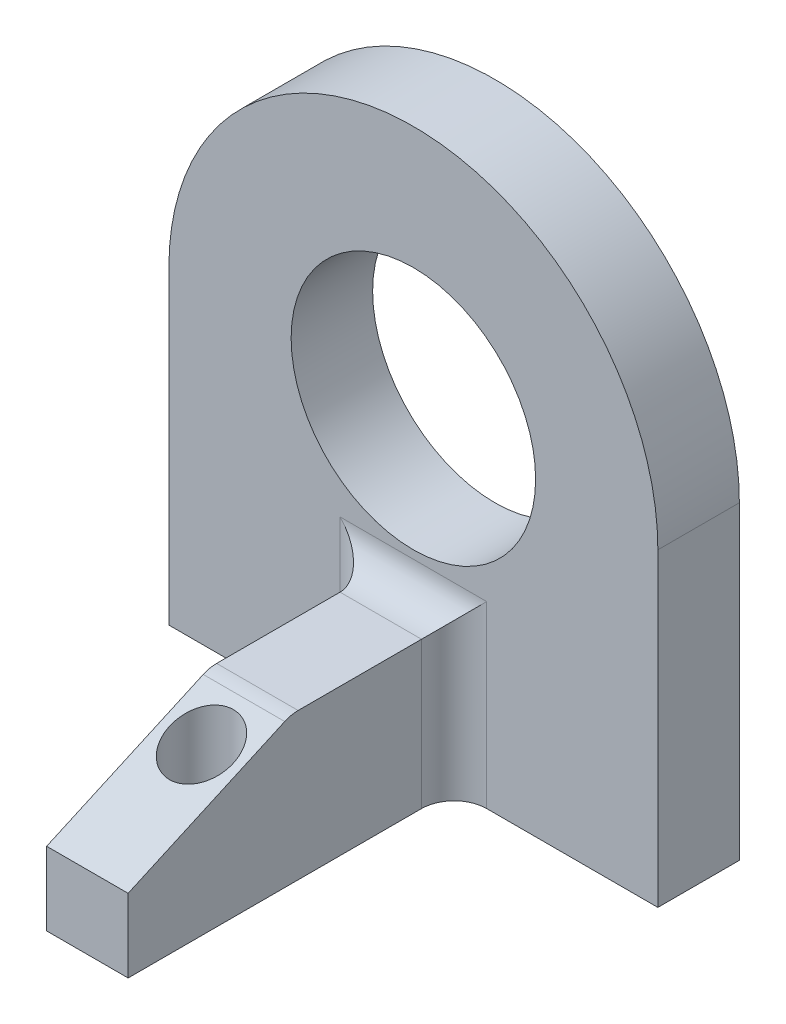
ISO-10303-21;
HEADER;
FILE_DESCRIPTION(('STEP AP214'),'2;1');
FILE_NAME('part.step','',(''),(''),'','','');
FILE_SCHEMA(('AUTOMOTIVE_DESIGN { 1 0 10303 214 1 1 1 1 }'));
ENDSEC;
DATA;
#1=APPLICATION_CONTEXT('core data for automotive mechanical design processes');
#2=APPLICATION_PROTOCOL_DEFINITION('international standard','automotive_design',2000,#1);
#3=PRODUCT_CONTEXT('',#1,'mechanical');
#4=PRODUCT('Part','Part','',(#3));
#5=PRODUCT_RELATED_PRODUCT_CATEGORY('part','',(#4));
#6=PRODUCT_DEFINITION_FORMATION('','',#4);
#7=PRODUCT_DEFINITION_CONTEXT('part definition',#1,'design');
#8=PRODUCT_DEFINITION('design','',#6,#7);
#9=PRODUCT_DEFINITION_SHAPE('','',#8);
#10=(LENGTH_UNIT() NAMED_UNIT(*) SI_UNIT(.MILLI.,.METRE.));
#11=(NAMED_UNIT(*) PLANE_ANGLE_UNIT() SI_UNIT($,.RADIAN.));
#12=(NAMED_UNIT(*) SI_UNIT($,.STERADIAN.) SOLID_ANGLE_UNIT());
#13=UNCERTAINTY_MEASURE_WITH_UNIT(LENGTH_MEASURE(1.E-05),#10,'distance_accuracy_value','');
#14=(GEOMETRIC_REPRESENTATION_CONTEXT(3) GLOBAL_UNCERTAINTY_ASSIGNED_CONTEXT((#13)) GLOBAL_UNIT_ASSIGNED_CONTEXT((#10,
#11,#12)) REPRESENTATION_CONTEXT('',''));
#15=CARTESIAN_POINT('',(0.,0.,0.));
#16=DIRECTION('',(0.,0.,1.));
#17=DIRECTION('',(1.,0.,0.));
#18=AXIS2_PLACEMENT_3D('',#15,#16,#17);
#19=CARTESIAN_POINT('',(0.,0.,6.35));
#20=DIRECTION('',(0.,1.,0.));
#21=DIRECTION('',(0.,0.,1.));
#22=AXIS2_PLACEMENT_3D('',#19,#20,#21);
#23=PLANE('',#22);
#24=CARTESIAN_POINT('',(0.,0.,22.86));
#25=DIRECTION('',(0.,-1.,0.));
#26=DIRECTION('',(0.,0.,-1.));
#27=AXIS2_PLACEMENT_3D('',#24,#25,#26);
#28=CIRCLE('',#27,2.4892);
#29=CARTESIAN_POINT('',(0.,0.,20.3708));
#30=VERTEX_POINT('',#29);
#31=EDGE_CURVE('E194',#30,#30,#28,.T.);
#32=ORIENTED_EDGE('',*,*,#31,.F.);
#33=EDGE_LOOP('',(#32));
#34=FACE_BOUND('',#33,.T.);
#35=CARTESIAN_POINT('',(9.525,0.,3.175));
#36=DIRECTION('',(0.,-1.,0.));
#37=DIRECTION('',(0.,0.,-1.));
#38=AXIS2_PLACEMENT_3D('',#35,#36,#37);
#39=CIRCLE('',#38,2.4892);
#40=CARTESIAN_POINT('',(9.525,0.,0.6858));
#41=VERTEX_POINT('',#40);
#42=EDGE_CURVE('E193',#41,#41,#39,.T.);
#43=ORIENTED_EDGE('',*,*,#42,.F.);
#44=EDGE_LOOP('',(#43));
#45=FACE_BOUND('',#44,.T.);
#46=CARTESIAN_POINT('',(-9.525,0.,3.175));
#47=DIRECTION('',(0.,-1.,0.));
#48=DIRECTION('',(0.,0.,-1.));
#49=AXIS2_PLACEMENT_3D('',#46,#47,#48);
#50=CIRCLE('',#49,2.4892);
#51=CARTESIAN_POINT('',(-9.525,0.,0.6858));
#52=VERTEX_POINT('',#51);
#53=EDGE_CURVE('E229',#52,#52,#50,.T.);
#54=ORIENTED_EDGE('',*,*,#53,.F.);
#55=EDGE_LOOP('',(#54));
#56=FACE_BOUND('',#55,.T.);
#57=DIRECTION('',(1.,0.,0.));
#58=VECTOR('',#57,1.);
#59=CARTESIAN_POINT('',(0.,0.,0.));
#60=LINE('',#59,#58);
#61=CARTESIAN_POINT('',(-19.05,0.,0.));
#62=VERTEX_POINT('',#61);
#63=CARTESIAN_POINT('',(19.05,0.,0.));
#64=VERTEX_POINT('',#63);
#65=EDGE_CURVE('E168',#62,#64,#60,.T.);
#66=ORIENTED_EDGE('',*,*,#65,.T.);
#67=DIRECTION('',(0.,0.,-1.));
#68=VECTOR('',#67,1.);
#69=CARTESIAN_POINT('',(19.05,0.,6.35));
#70=LINE('',#69,#68);
#71=CARTESIAN_POINT('',(19.05,0.,6.35));
#72=VERTEX_POINT('',#71);
#73=EDGE_CURVE('E139',#72,#64,#70,.T.);
#74=ORIENTED_EDGE('',*,*,#73,.F.);
#75=DIRECTION('',(1.,0.,0.));
#76=VECTOR('',#75,1.);
#77=CARTESIAN_POINT('',(0.,0.,6.35));
#78=LINE('',#77,#76);
#79=CARTESIAN_POINT('',(5.715,0.,6.35));
#80=VERTEX_POINT('',#79);
#81=EDGE_CURVE('E175',#80,#72,#78,.T.);
#82=ORIENTED_EDGE('',*,*,#81,.F.);
#83=CARTESIAN_POINT('',(5.715,0.,8.89));
#84=DIRECTION('',(0.,1.,0.));
#85=DIRECTION('',(0.,0.,1.));
#86=AXIS2_PLACEMENT_3D('',#83,#84,#85);
#87=CIRCLE('',#86,2.54);
#88=CARTESIAN_POINT('',(3.175,0.,8.89));
#89=VERTEX_POINT('',#88);
#90=EDGE_CURVE('E47',#80,#89,#87,.T.);
#91=ORIENTED_EDGE('',*,*,#90,.T.);
#92=DIRECTION('',(0.,0.,-1.));
#93=VECTOR('',#92,1.);
#94=CARTESIAN_POINT('',(3.175,0.,31.75));
#95=LINE('',#94,#93);
#96=CARTESIAN_POINT('',(3.175,0.,31.75));
#97=VERTEX_POINT('',#96);
#98=EDGE_CURVE('E160',#97,#89,#95,.T.);
#99=ORIENTED_EDGE('',*,*,#98,.F.);
#100=DIRECTION('',(1.,0.,0.));
#101=VECTOR('',#100,1.);
#102=CARTESIAN_POINT('',(-3.175,0.,31.75));
#103=LINE('',#102,#101);
#104=CARTESIAN_POINT('',(-3.175,0.,31.75));
#105=VERTEX_POINT('',#104);
#106=EDGE_CURVE('E152',#105,#97,#103,.T.);
#107=ORIENTED_EDGE('',*,*,#106,.F.);
#108=DIRECTION('',(0.,0.,-1.));
#109=VECTOR('',#108,1.);
#110=CARTESIAN_POINT('',(-3.175,0.,31.75));
#111=LINE('',#110,#109);
#112=CARTESIAN_POINT('',(-3.175,0.,8.89));
#113=VERTEX_POINT('',#112);
#114=EDGE_CURVE('E165',#105,#113,#111,.T.);
#115=ORIENTED_EDGE('',*,*,#114,.T.);
#116=CARTESIAN_POINT('',(-5.715,0.,8.89));
#117=DIRECTION('',(0.,1.,0.));
#118=DIRECTION('',(0.,0.,1.));
#119=AXIS2_PLACEMENT_3D('',#116,#117,#118);
#120=CIRCLE('',#119,2.54);
#121=CARTESIAN_POINT('',(-5.715,0.,6.35));
#122=VERTEX_POINT('',#121);
#123=EDGE_CURVE('E12',#113,#122,#120,.T.);
#124=ORIENTED_EDGE('',*,*,#123,.T.);
#125=CARTESIAN_POINT('',(-19.05,0.,6.35));
#126=VERTEX_POINT('',#125);
#127=EDGE_CURVE('E179',#126,#122,#78,.T.);
#128=ORIENTED_EDGE('',*,*,#127,.F.);
#129=DIRECTION('',(0.,0.,-1.));
#130=VECTOR('',#129,1.);
#131=CARTESIAN_POINT('',(-19.05,0.,6.35));
#132=LINE('',#131,#130);
#133=EDGE_CURVE('E252',#126,#62,#132,.T.);
#134=ORIENTED_EDGE('',*,*,#133,.T.);
#135=EDGE_LOOP('',(#66,#74,#82,#91,#99,#107,#115,#124,#128,#134));
#136=FACE_BOUND('',#135,.T.);
#137=ADVANCED_FACE('F38',(#34,#45,#56,#136),#23,.F.);
#138=CARTESIAN_POINT('',(19.05,0.,6.35));
#139=DIRECTION('',(-1.,0.,0.));
#140=DIRECTION('',(0.,-1.,0.));
#141=AXIS2_PLACEMENT_3D('',#138,#139,#140);
#142=PLANE('',#141);
#143=DIRECTION('',(0.,1.,0.));
#144=VECTOR('',#143,1.);
#145=CARTESIAN_POINT('',(19.05,0.,0.));
#146=LINE('',#145,#144);
#147=CARTESIAN_POINT('',(19.05,24.13,0.));
#148=VERTEX_POINT('',#147);
#149=EDGE_CURVE('E255',#64,#148,#146,.T.);
#150=ORIENTED_EDGE('',*,*,#149,.T.);
#151=DIRECTION('',(0.,0.,-1.));
#152=VECTOR('',#151,1.);
#153=CARTESIAN_POINT('',(19.05,24.13,6.35));
#154=LINE('',#153,#152);
#155=CARTESIAN_POINT('',(19.05,24.13,6.35));
#156=VERTEX_POINT('',#155);
#157=EDGE_CURVE('E272',#156,#148,#154,.T.);
#158=ORIENTED_EDGE('',*,*,#157,.F.);
#159=DIRECTION('',(0.,1.,0.));
#160=VECTOR('',#159,1.);
#161=CARTESIAN_POINT('',(19.05,0.,6.35));
#162=LINE('',#161,#160);
#163=EDGE_CURVE('E171',#72,#156,#162,.T.);
#164=ORIENTED_EDGE('',*,*,#163,.F.);
#165=ORIENTED_EDGE('',*,*,#73,.T.);
#166=EDGE_LOOP('',(#150,#158,#164,#165));
#167=FACE_BOUND('',#166,.T.);
#168=ADVANCED_FACE('F241',(#167),#142,.F.);
#169=CARTESIAN_POINT('',(0.,24.13,6.35));
#170=DIRECTION('',(0.,0.,-1.));
#171=DIRECTION('',(-1.,0.,0.));
#172=AXIS2_PLACEMENT_3D('',#169,#170,#171);
#173=CYLINDRICAL_SURFACE('',#172,19.05);
#174=CARTESIAN_POINT('',(0.,24.13,0.));
#175=DIRECTION('',(0.,0.,1.));
#176=DIRECTION('',(1.,0.,0.));
#177=AXIS2_PLACEMENT_3D('',#174,#175,#176);
#178=CIRCLE('',#177,19.05);
#179=CARTESIAN_POINT('',(-19.05,24.13,0.));
#180=VERTEX_POINT('',#179);
#181=EDGE_CURVE('E257',#148,#180,#178,.T.);
#182=ORIENTED_EDGE('',*,*,#181,.T.);
#183=DIRECTION('',(0.,0.,-1.));
#184=VECTOR('',#183,1.);
#185=CARTESIAN_POINT('',(-19.05,24.13,6.35));
#186=LINE('',#185,#184);
#187=CARTESIAN_POINT('',(-19.05,24.13,6.35));
#188=VERTEX_POINT('',#187);
#189=EDGE_CURVE('E270',#188,#180,#186,.T.);
#190=ORIENTED_EDGE('',*,*,#189,.F.);
#191=CARTESIAN_POINT('',(0.,24.13,6.35));
#192=DIRECTION('',(0.,0.,1.));
#193=DIRECTION('',(1.,0.,0.));
#194=AXIS2_PLACEMENT_3D('',#191,#192,#193);
#195=CIRCLE('',#194,19.05);
#196=EDGE_CURVE('E280',#156,#188,#195,.T.);
#197=ORIENTED_EDGE('',*,*,#196,.F.);
#198=ORIENTED_EDGE('',*,*,#157,.T.);
#199=EDGE_LOOP('',(#182,#190,#197,#198));
#200=FACE_BOUND('',#199,.T.);
#201=ADVANCED_FACE('F306',(#200),#173,.T.);
#202=CARTESIAN_POINT('',(-19.05,0.,6.35));
#203=DIRECTION('',(1.,0.,0.));
#204=DIRECTION('',(0.,1.,0.));
#205=AXIS2_PLACEMENT_3D('',#202,#203,#204);
#206=PLANE('',#205);
#207=DIRECTION('',(0.,-1.,0.));
#208=VECTOR('',#207,1.);
#209=CARTESIAN_POINT('',(-19.05,0.,0.));
#210=LINE('',#209,#208);
#211=EDGE_CURVE('E264',#180,#62,#210,.T.);
#212=ORIENTED_EDGE('',*,*,#211,.T.);
#213=ORIENTED_EDGE('',*,*,#133,.F.);
#214=DIRECTION('',(0.,-1.,0.));
#215=VECTOR('',#214,1.);
#216=CARTESIAN_POINT('',(-19.05,0.,6.35));
#217=LINE('',#216,#215);
#218=EDGE_CURVE('E281',#188,#126,#217,.T.);
#219=ORIENTED_EDGE('',*,*,#218,.F.);
#220=ORIENTED_EDGE('',*,*,#189,.T.);
#221=EDGE_LOOP('',(#212,#213,#219,#220));
#222=FACE_BOUND('',#221,.T.);
#223=ADVANCED_FACE('F299',(#222),#206,.F.);
#224=CARTESIAN_POINT('',(0.,24.13,6.35));
#225=DIRECTION('',(0.,0.,-1.));
#226=DIRECTION('',(-1.,0.,0.));
#227=AXIS2_PLACEMENT_3D('',#224,#225,#226);
#228=CYLINDRICAL_SURFACE('',#227,9.52500000000001);
#229=CARTESIAN_POINT('',(0.,24.13,6.35));
#230=DIRECTION('',(0.,0.,1.));
#231=DIRECTION('',(1.,0.,0.));
#232=AXIS2_PLACEMENT_3D('',#229,#230,#231);
#233=CIRCLE('',#232,9.52500000000001);
#234=CARTESIAN_POINT('',(9.52500000000001,24.13,6.35));
#235=VERTEX_POINT('',#234);
#236=EDGE_CURVE('E260',#235,#235,#233,.T.);
#237=ORIENTED_EDGE('',*,*,#236,.T.);
#238=EDGE_LOOP('',(#237));
#239=FACE_BOUND('',#238,.T.);
#240=CARTESIAN_POINT('',(0.,24.13,0.));
#241=DIRECTION('',(0.,0.,1.));
#242=DIRECTION('',(1.,0.,0.));
#243=AXIS2_PLACEMENT_3D('',#240,#241,#242);
#244=CIRCLE('',#243,9.52500000000001);
#245=CARTESIAN_POINT('',(9.52500000000001,24.13,0.));
#246=VERTEX_POINT('',#245);
#247=EDGE_CURVE('E266',#246,#246,#244,.T.);
#248=ORIENTED_EDGE('',*,*,#247,.F.);
#249=EDGE_LOOP('',(#248));
#250=FACE_BOUND('',#249,.T.);
#251=ADVANCED_FACE('F287',(#239,#250),#228,.F.);
#252=CARTESIAN_POINT('',(0.,0.,6.35));
#253=DIRECTION('',(0.,0.,1.));
#254=DIRECTION('',(1.,0.,0.));
#255=AXIS2_PLACEMENT_3D('',#252,#253,#254);
#256=PLANE('',#255);
#257=DIRECTION('',(-1.,0.,0.));
#258=VECTOR('',#257,1.);
#259=CARTESIAN_POINT('',(0.,13.97,6.35));
#260=LINE('',#259,#258);
#261=CARTESIAN_POINT('',(-5.715,13.97,6.35));
#262=VERTEX_POINT('',#261);
#263=CARTESIAN_POINT('',(5.715,13.97,6.35));
#264=VERTEX_POINT('',#263);
#265=EDGE_CURVE('E55',#262,#264,#260,.F.);
#266=ORIENTED_EDGE('',*,*,#265,.T.);
#267=DIRECTION('',(0.,1.,0.));
#268=VECTOR('',#267,1.);
#269=CARTESIAN_POINT('',(5.715,0.,6.35));
#270=LINE('',#269,#268);
#271=EDGE_CURVE('E210',#264,#80,#270,.F.);
#272=ORIENTED_EDGE('',*,*,#271,.T.);
#273=ORIENTED_EDGE('',*,*,#81,.T.);
#274=ORIENTED_EDGE('',*,*,#163,.T.);
#275=ORIENTED_EDGE('',*,*,#196,.T.);
#276=ORIENTED_EDGE('',*,*,#218,.T.);
#277=ORIENTED_EDGE('',*,*,#127,.T.);
#278=DIRECTION('',(0.,-1.,0.));
#279=VECTOR('',#278,1.);
#280=CARTESIAN_POINT('',(-5.715,0.,6.35));
#281=LINE('',#280,#279);
#282=EDGE_CURVE('E60',#122,#262,#281,.F.);
#283=ORIENTED_EDGE('',*,*,#282,.T.);
#284=EDGE_LOOP('',(#266,#272,#273,#274,#275,#276,#277,#283));
#285=FACE_BOUND('',#284,.T.);
#286=ORIENTED_EDGE('',*,*,#236,.F.);
#287=EDGE_LOOP('',(#286));
#288=FACE_BOUND('',#287,.T.);
#289=ADVANCED_FACE('F290',(#285,#288),#256,.T.);
#290=CARTESIAN_POINT('',(0.,0.,0.));
#291=DIRECTION('',(0.,0.,1.));
#292=DIRECTION('',(1.,0.,0.));
#293=AXIS2_PLACEMENT_3D('',#290,#291,#292);
#294=PLANE('',#293);
#295=ORIENTED_EDGE('',*,*,#65,.F.);
#296=ORIENTED_EDGE('',*,*,#211,.F.);
#297=ORIENTED_EDGE('',*,*,#181,.F.);
#298=ORIENTED_EDGE('',*,*,#149,.F.);
#299=EDGE_LOOP('',(#295,#296,#297,#298));
#300=FACE_BOUND('',#299,.T.);
#301=ORIENTED_EDGE('',*,*,#247,.T.);
#302=EDGE_LOOP('',(#301));
#303=FACE_BOUND('',#302,.T.);
#304=ADVANCED_FACE('F292',(#300,#303),#294,.F.);
#305=CARTESIAN_POINT('',(3.175,0.,31.75));
#306=DIRECTION('',(-1.,0.,0.));
#307=DIRECTION('',(0.,0.,1.));
#308=AXIS2_PLACEMENT_3D('',#305,#306,#307);
#309=PLANE('',#308);
#310=DIRECTION('',(0.,0.,-1.));
#311=VECTOR('',#310,1.);
#312=CARTESIAN_POINT('',(3.175,11.43,31.75));
#313=LINE('',#312,#311);
#314=CARTESIAN_POINT('',(3.175,11.43,18.5048278903743));
#315=VERTEX_POINT('',#314);
#316=CARTESIAN_POINT('',(3.175,11.43,8.89));
#317=VERTEX_POINT('',#316);
#318=EDGE_CURVE('E164',#315,#317,#313,.T.);
#319=ORIENTED_EDGE('',*,*,#318,.F.);
#320=CARTESIAN_POINT('',(3.175,8.89,18.5048278903743));
#321=DIRECTION('',(-1.,0.,0.));
#322=DIRECTION('',(0.,0.,1.));
#323=AXIS2_PLACEMENT_3D('',#320,#321,#322);
#324=CIRCLE('',#323,2.54);
#325=CARTESIAN_POINT('',(3.175,11.2062806231448,19.5471541707894));
#326=VERTEX_POINT('',#325);
#327=EDGE_CURVE('E147',#315,#326,#324,.F.);
#328=ORIENTED_EDGE('',*,*,#327,.T.);
#329=DIRECTION('',(0.,0.410364677328798,-0.911921505175107));
#330=VECTOR('',#329,1.);
#331=CARTESIAN_POINT('',(3.175,16.6340956340956,7.48534303534303));
#332=LINE('',#331,#330);
#333=CARTESIAN_POINT('',(3.175,5.715,31.75));
#334=VERTEX_POINT('',#333);
#335=EDGE_CURVE('E131',#334,#326,#332,.T.);
#336=ORIENTED_EDGE('',*,*,#335,.F.);
#337=DIRECTION('',(0.,1.,0.));
#338=VECTOR('',#337,1.);
#339=CARTESIAN_POINT('',(3.175,0.,31.75));
#340=LINE('',#339,#338);
#341=EDGE_CURVE('E146',#97,#334,#340,.T.);
#342=ORIENTED_EDGE('',*,*,#341,.F.);
#343=ORIENTED_EDGE('',*,*,#98,.T.);
#344=DIRECTION('',(0.,1.,0.));
#345=VECTOR('',#344,1.);
#346=CARTESIAN_POINT('',(3.175,0.,8.89));
#347=LINE('',#346,#345);
#348=EDGE_CURVE('E199',#89,#317,#347,.T.);
#349=ORIENTED_EDGE('',*,*,#348,.T.);
#350=EDGE_LOOP('',(#319,#328,#336,#342,#343,#349));
#351=FACE_BOUND('',#350,.T.);
#352=ADVANCED_FACE('F144',(#351),#309,.F.);
#353=CARTESIAN_POINT('',(-3.175,11.43,31.75));
#354=DIRECTION('',(0.,-1.,0.));
#355=DIRECTION('',(0.,0.,-1.));
#356=AXIS2_PLACEMENT_3D('',#353,#354,#355);
#357=PLANE('',#356);
#358=DIRECTION('',(0.,0.,-1.));
#359=VECTOR('',#358,1.);
#360=CARTESIAN_POINT('',(-3.175,11.43,31.75));
#361=LINE('',#360,#359);
#362=CARTESIAN_POINT('',(-3.175,11.43,18.5048278903743));
#363=VERTEX_POINT('',#362);
#364=CARTESIAN_POINT('',(-3.175,11.43,8.89));
#365=VERTEX_POINT('',#364);
#366=EDGE_CURVE('E161',#363,#365,#361,.T.);
#367=ORIENTED_EDGE('',*,*,#366,.F.);
#368=DIRECTION('',(1.,0.,0.));
#369=VECTOR('',#368,1.);
#370=CARTESIAN_POINT('',(-3.175,11.43,18.5048278903743));
#371=LINE('',#370,#369);
#372=EDGE_CURVE('E196',#363,#315,#371,.T.);
#373=ORIENTED_EDGE('',*,*,#372,.T.);
#374=ORIENTED_EDGE('',*,*,#318,.T.);
#375=DIRECTION('',(-1.,0.,0.));
#376=VECTOR('',#375,1.);
#377=CARTESIAN_POINT('',(-3.175,11.43,8.89));
#378=LINE('',#377,#376);
#379=EDGE_CURVE('E138',#317,#365,#378,.T.);
#380=ORIENTED_EDGE('',*,*,#379,.T.);
#381=EDGE_LOOP('',(#367,#373,#374,#380));
#382=FACE_BOUND('',#381,.T.);
#383=ADVANCED_FACE('F333',(#382),#357,.F.);
#384=CARTESIAN_POINT('',(-3.175,0.,31.75));
#385=DIRECTION('',(1.,0.,0.));
#386=DIRECTION('',(0.,0.,-1.));
#387=AXIS2_PLACEMENT_3D('',#384,#385,#386);
#388=PLANE('',#387);
#389=DIRECTION('',(0.,0.410364677328798,-0.911921505175107));
#390=VECTOR('',#389,1.);
#391=CARTESIAN_POINT('',(-3.175,4.75259875259876,33.8886694386694));
#392=LINE('',#391,#390);
#393=CARTESIAN_POINT('',(-3.175,5.715,31.75));
#394=VERTEX_POINT('',#393);
#395=CARTESIAN_POINT('',(-3.175,11.2062806231448,19.5471541707894));
#396=VERTEX_POINT('',#395);
#397=EDGE_CURVE('E134',#394,#396,#392,.T.);
#398=ORIENTED_EDGE('',*,*,#397,.T.);
#399=CARTESIAN_POINT('',(-3.175,8.89,18.5048278903743));
#400=DIRECTION('',(1.,0.,0.));
#401=DIRECTION('',(0.,0.,-1.));
#402=AXIS2_PLACEMENT_3D('',#399,#400,#401);
#403=CIRCLE('',#402,2.54);
#404=EDGE_CURVE('E206',#396,#363,#403,.F.);
#405=ORIENTED_EDGE('',*,*,#404,.T.);
#406=ORIENTED_EDGE('',*,*,#366,.T.);
#407=DIRECTION('',(0.,-1.,0.));
#408=VECTOR('',#407,1.);
#409=CARTESIAN_POINT('',(-3.175,0.,8.89));
#410=LINE('',#409,#408);
#411=EDGE_CURVE('E205',#365,#113,#410,.T.);
#412=ORIENTED_EDGE('',*,*,#411,.T.);
#413=ORIENTED_EDGE('',*,*,#114,.F.);
#414=DIRECTION('',(0.,-1.,0.));
#415=VECTOR('',#414,1.);
#416=CARTESIAN_POINT('',(-3.175,0.,31.75));
#417=LINE('',#416,#415);
#418=EDGE_CURVE('E154',#394,#105,#417,.T.);
#419=ORIENTED_EDGE('',*,*,#418,.F.);
#420=EDGE_LOOP('',(#398,#405,#406,#412,#413,#419));
#421=FACE_BOUND('',#420,.T.);
#422=ADVANCED_FACE('F330',(#421),#388,.F.);
#423=CARTESIAN_POINT('',(0.,0.,31.75));
#424=DIRECTION('',(0.,0.,-1.));
#425=DIRECTION('',(-1.,0.,0.));
#426=AXIS2_PLACEMENT_3D('',#423,#424,#425);
#427=PLANE('',#426);
#428=ORIENTED_EDGE('',*,*,#341,.T.);
#429=DIRECTION('',(-1.,0.,0.));
#430=VECTOR('',#429,1.);
#431=CARTESIAN_POINT('',(0.,5.715,31.75));
#432=LINE('',#431,#430);
#433=EDGE_CURVE('E128',#334,#394,#432,.T.);
#434=ORIENTED_EDGE('',*,*,#433,.T.);
#435=ORIENTED_EDGE('',*,*,#418,.T.);
#436=ORIENTED_EDGE('',*,*,#106,.T.);
#437=EDGE_LOOP('',(#428,#434,#435,#436));
#438=FACE_BOUND('',#437,.T.);
#439=ADVANCED_FACE('F150',(#438),#427,.F.);
#440=CARTESIAN_POINT('',(-22.225,16.6340956340956,7.48534303534303));
#441=DIRECTION('',(0.,-0.911921505175106,-0.410364677328798));
#442=DIRECTION('',(0.,0.410364677328798,-0.911921505175107));
#443=AXIS2_PLACEMENT_3D('',#440,#441,#442);
#444=PLANE('',#443);
#445=CARTESIAN_POINT('',(0.,9.7155,22.86));
#446=DIRECTION('',(0.,-0.911921505175106,-0.410364677328798));
#447=DIRECTION('',(0.,-0.410364677328798,0.911921505175107));
#448=AXIS2_PLACEMENT_3D('',#445,#446,#447);
#449=ELLIPSE('',#448,2.72962090034495,2.4892);
#450=CARTESIAN_POINT('',(0.,8.59536,25.3492));
#451=VERTEX_POINT('',#450);
#452=EDGE_CURVE('E190',#451,#451,#449,.T.);
#453=ORIENTED_EDGE('',*,*,#452,.T.);
#454=EDGE_LOOP('',(#453));
#455=FACE_BOUND('',#454,.T.);
#456=ORIENTED_EDGE('',*,*,#335,.T.);
#457=DIRECTION('',(1.,0.,0.));
#458=VECTOR('',#457,1.);
#459=CARTESIAN_POINT('',(-22.225,11.2062806231448,19.5471541707894));
#460=LINE('',#459,#458);
#461=EDGE_CURVE('E203',#326,#396,#460,.F.);
#462=ORIENTED_EDGE('',*,*,#461,.T.);
#463=ORIENTED_EDGE('',*,*,#397,.F.);
#464=ORIENTED_EDGE('',*,*,#433,.F.);
#465=EDGE_LOOP('',(#456,#462,#463,#464));
#466=FACE_BOUND('',#465,.T.);
#467=ADVANCED_FACE('F130',(#455,#466),#444,.F.);
#468=CARTESIAN_POINT('',(-9.525,12.7,3.175));
#469=DIRECTION('',(0.,-1.,0.));
#470=DIRECTION('',(0.,0.,-1.));
#471=AXIS2_PLACEMENT_3D('',#468,#469,#470);
#472=CYLINDRICAL_SURFACE('',#471,2.4892);
#473=CARTESIAN_POINT('',(-9.525,12.7,3.175));
#474=DIRECTION('',(0.,-1.,0.));
#475=DIRECTION('',(0.,0.,-1.));
#476=AXIS2_PLACEMENT_3D('',#473,#474,#475);
#477=CIRCLE('',#476,2.4892);
#478=CARTESIAN_POINT('',(-9.525,12.7,0.6858));
#479=VERTEX_POINT('',#478);
#480=EDGE_CURVE('E148',#479,#479,#477,.T.);
#481=ORIENTED_EDGE('',*,*,#480,.F.);
#482=EDGE_LOOP('',(#481));
#483=FACE_BOUND('',#482,.T.);
#484=ORIENTED_EDGE('',*,*,#53,.T.);
#485=EDGE_LOOP('',(#484));
#486=FACE_BOUND('',#485,.T.);
#487=ADVANCED_FACE('F237',(#483,#486),#472,.F.);
#488=CARTESIAN_POINT('',(-9.525,12.7,3.175));
#489=DIRECTION('',(0.,-1.,0.));
#490=DIRECTION('',(0.,0.,-1.));
#491=AXIS2_PLACEMENT_3D('',#488,#489,#490);
#492=PLANE('',#491);
#493=ORIENTED_EDGE('',*,*,#480,.T.);
#494=EDGE_LOOP('',(#493));
#495=FACE_BOUND('',#494,.T.);
#496=ADVANCED_FACE('F349',(#495),#492,.T.);
#497=CARTESIAN_POINT('',(9.525,12.7,3.175));
#498=DIRECTION('',(0.,-1.,0.));
#499=DIRECTION('',(0.,0.,-1.));
#500=AXIS2_PLACEMENT_3D('',#497,#498,#499);
#501=CYLINDRICAL_SURFACE('',#500,2.4892);
#502=CARTESIAN_POINT('',(9.525,12.7,3.175));
#503=DIRECTION('',(0.,-1.,0.));
#504=DIRECTION('',(0.,0.,-1.));
#505=AXIS2_PLACEMENT_3D('',#502,#503,#504);
#506=CIRCLE('',#505,2.4892);
#507=CARTESIAN_POINT('',(9.525,12.7,0.6858));
#508=VERTEX_POINT('',#507);
#509=EDGE_CURVE('E226',#508,#508,#506,.T.);
#510=ORIENTED_EDGE('',*,*,#509,.F.);
#511=EDGE_LOOP('',(#510));
#512=FACE_BOUND('',#511,.T.);
#513=ORIENTED_EDGE('',*,*,#42,.T.);
#514=EDGE_LOOP('',(#513));
#515=FACE_BOUND('',#514,.T.);
#516=ADVANCED_FACE('F353',(#512,#515),#501,.F.);
#517=CARTESIAN_POINT('',(9.525,12.7,3.175));
#518=DIRECTION('',(0.,-1.,0.));
#519=DIRECTION('',(0.,0.,-1.));
#520=AXIS2_PLACEMENT_3D('',#517,#518,#519);
#521=PLANE('',#520);
#522=ORIENTED_EDGE('',*,*,#509,.T.);
#523=EDGE_LOOP('',(#522));
#524=FACE_BOUND('',#523,.T.);
#525=ADVANCED_FACE('F357',(#524),#521,.T.);
#526=CARTESIAN_POINT('',(0.,12.7,22.86));
#527=DIRECTION('',(0.,-1.,0.));
#528=DIRECTION('',(0.,0.,-1.));
#529=AXIS2_PLACEMENT_3D('',#526,#527,#528);
#530=CYLINDRICAL_SURFACE('',#529,2.4892);
#531=ORIENTED_EDGE('',*,*,#31,.T.);
#532=EDGE_LOOP('',(#531));
#533=FACE_BOUND('',#532,.T.);
#534=ORIENTED_EDGE('',*,*,#452,.F.);
#535=EDGE_LOOP('',(#534));
#536=FACE_BOUND('',#535,.T.);
#537=ADVANCED_FACE('F315',(#533,#536),#530,.F.);
#538=CARTESIAN_POINT('',(-3.175,8.89,18.5048278903743));
#539=DIRECTION('',(1.,0.,0.));
#540=DIRECTION('',(0.,0.,-1.));
#541=AXIS2_PLACEMENT_3D('',#538,#539,#540);
#542=CYLINDRICAL_SURFACE('',#541,2.54);
#543=ORIENTED_EDGE('',*,*,#404,.F.);
#544=ORIENTED_EDGE('',*,*,#461,.F.);
#545=ORIENTED_EDGE('',*,*,#327,.F.);
#546=ORIENTED_EDGE('',*,*,#372,.F.);
#547=EDGE_LOOP('',(#543,#544,#545,#546));
#548=FACE_BOUND('',#547,.T.);
#549=ADVANCED_FACE('F312',(#548),#542,.T.);
#550=CARTESIAN_POINT('',(-5.715,0.,8.89));
#551=DIRECTION('',(0.,-1.,0.));
#552=DIRECTION('',(0.,0.,-1.));
#553=AXIS2_PLACEMENT_3D('',#550,#551,#552);
#554=CYLINDRICAL_SURFACE('',#553,2.54);
#555=ORIENTED_EDGE('',*,*,#123,.F.);
#556=ORIENTED_EDGE('',*,*,#411,.F.);
#557=CARTESIAN_POINT('',(-5.715,13.97,8.89));
#558=DIRECTION('',(-0.707106781186547,-0.707106781186547,0.));
#559=DIRECTION('',(0.707106781186547,-0.707106781186547,0.));
#560=AXIS2_PLACEMENT_3D('',#557,#558,#559);
#561=ELLIPSE('',#560,3.59210244842766,2.54);
#562=EDGE_CURVE('E42',#262,#365,#561,.T.);
#563=ORIENTED_EDGE('',*,*,#562,.F.);
#564=ORIENTED_EDGE('',*,*,#282,.F.);
#565=EDGE_LOOP('',(#555,#556,#563,#564));
#566=FACE_BOUND('',#565,.T.);
#567=ADVANCED_FACE('F40',(#566),#554,.F.);
#568=CARTESIAN_POINT('',(-3.175,13.97,8.89));
#569=DIRECTION('',(-1.,0.,0.));
#570=DIRECTION('',(0.,0.,1.));
#571=AXIS2_PLACEMENT_3D('',#568,#569,#570);
#572=CYLINDRICAL_SURFACE('',#571,2.54);
#573=ORIENTED_EDGE('',*,*,#562,.T.);
#574=ORIENTED_EDGE('',*,*,#379,.F.);
#575=CARTESIAN_POINT('',(5.715,13.97,8.89));
#576=DIRECTION('',(-0.707106781186547,0.707106781186547,0.));
#577=DIRECTION('',(-0.707106781186547,-0.707106781186547,0.));
#578=AXIS2_PLACEMENT_3D('',#575,#576,#577);
#579=ELLIPSE('',#578,3.59210244842766,2.54);
#580=EDGE_CURVE('E214',#264,#317,#579,.T.);
#581=ORIENTED_EDGE('',*,*,#580,.F.);
#582=ORIENTED_EDGE('',*,*,#265,.F.);
#583=EDGE_LOOP('',(#573,#574,#581,#582));
#584=FACE_BOUND('',#583,.T.);
#585=ADVANCED_FACE('F319',(#584),#572,.F.);
#586=CARTESIAN_POINT('',(5.715,0.,8.89));
#587=DIRECTION('',(0.,1.,0.));
#588=DIRECTION('',(0.,0.,1.));
#589=AXIS2_PLACEMENT_3D('',#586,#587,#588);
#590=CYLINDRICAL_SURFACE('',#589,2.54);
#591=ORIENTED_EDGE('',*,*,#90,.F.);
#592=ORIENTED_EDGE('',*,*,#271,.F.);
#593=ORIENTED_EDGE('',*,*,#580,.T.);
#594=ORIENTED_EDGE('',*,*,#348,.F.);
#595=EDGE_LOOP('',(#591,#592,#593,#594));
#596=FACE_BOUND('',#595,.T.);
#597=ADVANCED_FACE('F317',(#596),#590,.F.);
#598=CLOSED_SHELL('',(#137,#168,#201,#223,#251,#289,#304,#352,#383,#422,#439,#467,#487,#496,
#516,#525,#537,#549,#567,#585,#597));
#599=MANIFOLD_SOLID_BREP('B2',#598);
#600=ADVANCED_BREP_SHAPE_REPRESENTATION('',(#18,#599),#14);
#601=SHAPE_DEFINITION_REPRESENTATION(#9,#600);
ENDSEC;
END-ISO-10303-21;
